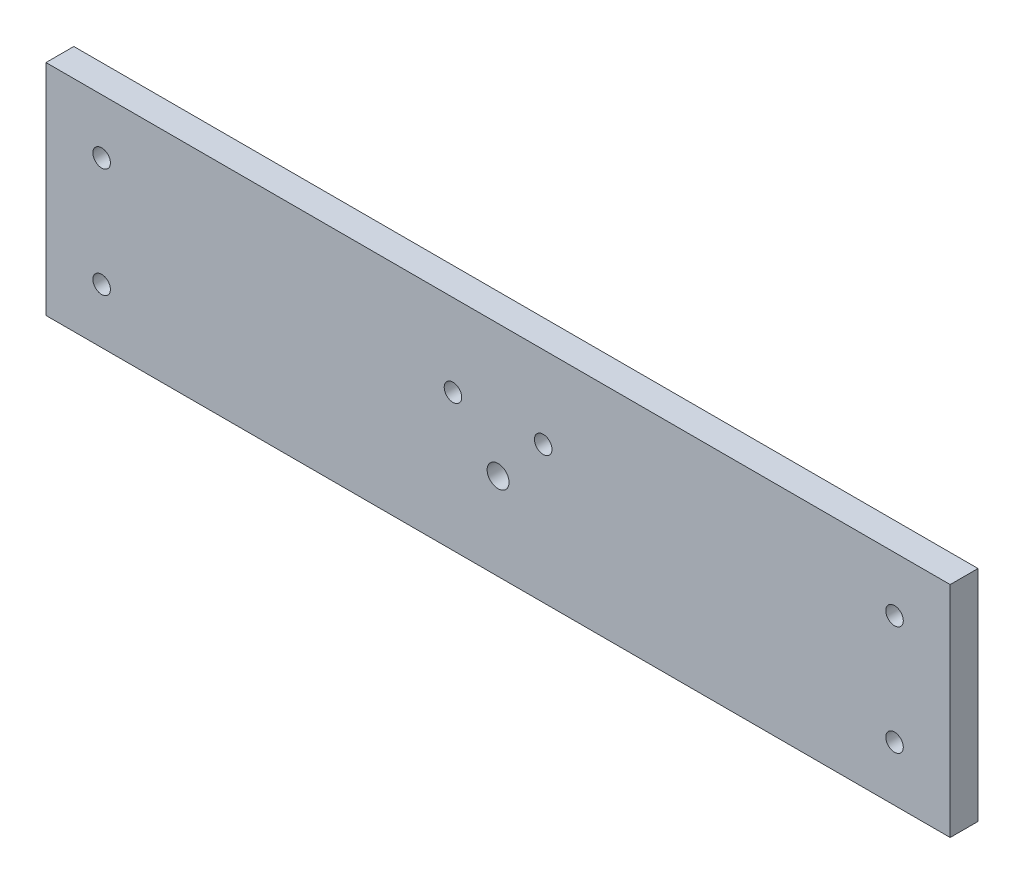
ISO-10303-21;
HEADER;
FILE_DESCRIPTION(('STEP AP214'),'2;1');
FILE_NAME('part.step','',(''),(''),'','','');
FILE_SCHEMA(('AUTOMOTIVE_DESIGN { 1 0 10303 214 1 1 1 1 }'));
ENDSEC;
DATA;
#1=APPLICATION_CONTEXT('core data for automotive mechanical design processes');
#2=APPLICATION_PROTOCOL_DEFINITION('international standard','automotive_design',2000,#1);
#3=PRODUCT_CONTEXT('',#1,'mechanical');
#4=PRODUCT('Part','Part','',(#3));
#5=PRODUCT_RELATED_PRODUCT_CATEGORY('part','',(#4));
#6=PRODUCT_DEFINITION_FORMATION('','',#4);
#7=PRODUCT_DEFINITION_CONTEXT('part definition',#1,'design');
#8=PRODUCT_DEFINITION('design','',#6,#7);
#9=PRODUCT_DEFINITION_SHAPE('','',#8);
#10=(LENGTH_UNIT() NAMED_UNIT(*) SI_UNIT(.MILLI.,.METRE.));
#11=(NAMED_UNIT(*) PLANE_ANGLE_UNIT() SI_UNIT($,.RADIAN.));
#12=(NAMED_UNIT(*) SI_UNIT($,.STERADIAN.) SOLID_ANGLE_UNIT());
#13=UNCERTAINTY_MEASURE_WITH_UNIT(LENGTH_MEASURE(1.E-05),#10,'distance_accuracy_value','');
#14=(GEOMETRIC_REPRESENTATION_CONTEXT(3) GLOBAL_UNCERTAINTY_ASSIGNED_CONTEXT((#13)) GLOBAL_UNIT_ASSIGNED_CONTEXT((#10,
#11,#12)) REPRESENTATION_CONTEXT('',''));
#15=CARTESIAN_POINT('',(0.,0.,0.));
#16=DIRECTION('',(0.,0.,1.));
#17=DIRECTION('',(1.,0.,0.));
#18=AXIS2_PLACEMENT_3D('',#15,#16,#17);
#19=CARTESIAN_POINT('',(-206.35,0.,12.7));
#20=DIRECTION('',(-1.,0.,0.));
#21=DIRECTION('',(0.,0.,1.));
#22=AXIS2_PLACEMENT_3D('',#19,#20,#21);
#23=PLANE('',#22);
#24=DIRECTION('',(0.,1.,0.));
#25=VECTOR('',#24,1.);
#26=CARTESIAN_POINT('',(-206.35,0.,0.));
#27=LINE('',#26,#25);
#28=CARTESIAN_POINT('',(-206.35,-50.,0.));
#29=VERTEX_POINT('',#28);
#30=CARTESIAN_POINT('',(-206.35,50.,0.));
#31=VERTEX_POINT('',#30);
#32=EDGE_CURVE('E114',#29,#31,#27,.T.);
#33=ORIENTED_EDGE('',*,*,#32,.F.);
#34=DIRECTION('',(0.,0.,-1.));
#35=VECTOR('',#34,1.);
#36=CARTESIAN_POINT('',(-206.35,-50.,12.7));
#37=LINE('',#36,#35);
#38=CARTESIAN_POINT('',(-206.35,-50.,12.7));
#39=VERTEX_POINT('',#38);
#40=EDGE_CURVE('E11',#39,#29,#37,.T.);
#41=ORIENTED_EDGE('',*,*,#40,.F.);
#42=DIRECTION('',(0.,1.,0.));
#43=VECTOR('',#42,1.);
#44=CARTESIAN_POINT('',(-206.35,0.,12.7));
#45=LINE('',#44,#43);
#46=CARTESIAN_POINT('',(-206.35,50.,12.7));
#47=VERTEX_POINT('',#46);
#48=EDGE_CURVE('E97',#39,#47,#45,.T.);
#49=ORIENTED_EDGE('',*,*,#48,.T.);
#50=DIRECTION('',(0.,0.,-1.));
#51=VECTOR('',#50,1.);
#52=CARTESIAN_POINT('',(-206.35,50.,12.7));
#53=LINE('',#52,#51);
#54=EDGE_CURVE('E76',#47,#31,#53,.T.);
#55=ORIENTED_EDGE('',*,*,#54,.T.);
#56=EDGE_LOOP('',(#33,#41,#49,#55));
#57=FACE_BOUND('',#56,.T.);
#58=ADVANCED_FACE('F36',(#57),#23,.T.);
#59=CARTESIAN_POINT('',(0.,-50.,12.7));
#60=DIRECTION('',(0.,-1.,0.));
#61=DIRECTION('',(1.,0.,0.));
#62=AXIS2_PLACEMENT_3D('',#59,#60,#61);
#63=PLANE('',#62);
#64=DIRECTION('',(-1.,0.,0.));
#65=VECTOR('',#64,1.);
#66=CARTESIAN_POINT('',(0.,-50.,0.));
#67=LINE('',#66,#65);
#68=CARTESIAN_POINT('',(206.35,-50.,0.));
#69=VERTEX_POINT('',#68);
#70=EDGE_CURVE('E88',#69,#29,#67,.T.);
#71=ORIENTED_EDGE('',*,*,#70,.F.);
#72=DIRECTION('',(0.,0.,-1.));
#73=VECTOR('',#72,1.);
#74=CARTESIAN_POINT('',(206.35,-50.,12.7));
#75=LINE('',#74,#73);
#76=CARTESIAN_POINT('',(206.35,-50.,12.7));
#77=VERTEX_POINT('',#76);
#78=EDGE_CURVE('E45',#77,#69,#75,.T.);
#79=ORIENTED_EDGE('',*,*,#78,.F.);
#80=DIRECTION('',(-1.,0.,0.));
#81=VECTOR('',#80,1.);
#82=CARTESIAN_POINT('',(0.,-50.,12.7));
#83=LINE('',#82,#81);
#84=EDGE_CURVE('E86',#77,#39,#83,.T.);
#85=ORIENTED_EDGE('',*,*,#84,.T.);
#86=ORIENTED_EDGE('',*,*,#40,.T.);
#87=EDGE_LOOP('',(#71,#79,#85,#86));
#88=FACE_BOUND('',#87,.T.);
#89=ADVANCED_FACE('F84',(#88),#63,.T.);
#90=CARTESIAN_POINT('',(206.35,0.,12.7));
#91=DIRECTION('',(-1.,0.,0.));
#92=DIRECTION('',(0.,0.,1.));
#93=AXIS2_PLACEMENT_3D('',#90,#91,#92);
#94=PLANE('',#93);
#95=DIRECTION('',(0.,1.,0.));
#96=VECTOR('',#95,1.);
#97=CARTESIAN_POINT('',(206.35,0.,0.));
#98=LINE('',#97,#96);
#99=CARTESIAN_POINT('',(206.35,50.,0.));
#100=VERTEX_POINT('',#99);
#101=EDGE_CURVE('E117',#69,#100,#98,.T.);
#102=ORIENTED_EDGE('',*,*,#101,.T.);
#103=DIRECTION('',(0.,0.,-1.));
#104=VECTOR('',#103,1.);
#105=CARTESIAN_POINT('',(206.35,50.,12.7));
#106=LINE('',#105,#104);
#107=CARTESIAN_POINT('',(206.35,50.,12.7));
#108=VERTEX_POINT('',#107);
#109=EDGE_CURVE('E91',#108,#100,#106,.T.);
#110=ORIENTED_EDGE('',*,*,#109,.F.);
#111=DIRECTION('',(0.,1.,0.));
#112=VECTOR('',#111,1.);
#113=CARTESIAN_POINT('',(206.35,0.,12.7));
#114=LINE('',#113,#112);
#115=EDGE_CURVE('E93',#77,#108,#114,.T.);
#116=ORIENTED_EDGE('',*,*,#115,.F.);
#117=ORIENTED_EDGE('',*,*,#78,.T.);
#118=EDGE_LOOP('',(#102,#110,#116,#117));
#119=FACE_BOUND('',#118,.T.);
#120=ADVANCED_FACE('F94',(#119),#94,.F.);
#121=CARTESIAN_POINT('',(-20.5900655847,12.5336144247,12.7));
#122=DIRECTION('',(0.,0.,-1.));
#123=DIRECTION('',(-1.,0.,0.));
#124=AXIS2_PLACEMENT_3D('',#121,#122,#123);
#125=CYLINDRICAL_SURFACE('',#124,3.99999999999999);
#126=CARTESIAN_POINT('',(-20.5900655847,12.5336144247,12.7));
#127=DIRECTION('',(0.,0.,1.));
#128=DIRECTION('',(1.,0.,0.));
#129=AXIS2_PLACEMENT_3D('',#126,#127,#128);
#130=CIRCLE('',#129,3.99999999999999);
#131=CARTESIAN_POINT('',(-16.5900655847,12.5336144247,12.7));
#132=VERTEX_POINT('',#131);
#133=EDGE_CURVE('E99',#132,#132,#130,.T.);
#134=ORIENTED_EDGE('',*,*,#133,.T.);
#135=EDGE_LOOP('',(#134));
#136=FACE_BOUND('',#135,.T.);
#137=CARTESIAN_POINT('',(-20.5900655847,12.5336144247,0.));
#138=DIRECTION('',(0.,0.,1.));
#139=DIRECTION('',(1.,0.,0.));
#140=AXIS2_PLACEMENT_3D('',#137,#138,#139);
#141=CIRCLE('',#140,3.99999999999999);
#142=CARTESIAN_POINT('',(-16.5900655847,12.5336144247,0.));
#143=VERTEX_POINT('',#142);
#144=EDGE_CURVE('E111',#143,#143,#141,.T.);
#145=ORIENTED_EDGE('',*,*,#144,.F.);
#146=EDGE_LOOP('',(#145));
#147=FACE_BOUND('',#146,.T.);
#148=ADVANCED_FACE('F133',(#136,#147),#125,.F.);
#149=CARTESIAN_POINT('',(20.5900655847,12.5336144247,12.7));
#150=DIRECTION('',(0.,0.,-1.));
#151=DIRECTION('',(-1.,0.,0.));
#152=AXIS2_PLACEMENT_3D('',#149,#150,#151);
#153=CYLINDRICAL_SURFACE('',#152,3.99999999999999);
#154=CARTESIAN_POINT('',(20.5900655847,12.5336144247,12.7));
#155=DIRECTION('',(0.,0.,1.));
#156=DIRECTION('',(1.,0.,0.));
#157=AXIS2_PLACEMENT_3D('',#154,#155,#156);
#158=CIRCLE('',#157,3.99999999999999);
#159=CARTESIAN_POINT('',(24.5900655847,12.5336144247,12.7));
#160=VERTEX_POINT('',#159);
#161=EDGE_CURVE('E146',#160,#160,#158,.T.);
#162=ORIENTED_EDGE('',*,*,#161,.T.);
#163=EDGE_LOOP('',(#162));
#164=FACE_BOUND('',#163,.T.);
#165=CARTESIAN_POINT('',(20.5900655847,12.5336144247,0.));
#166=DIRECTION('',(0.,0.,1.));
#167=DIRECTION('',(1.,0.,0.));
#168=AXIS2_PLACEMENT_3D('',#165,#166,#167);
#169=CIRCLE('',#168,3.99999999999999);
#170=CARTESIAN_POINT('',(24.5900655847,12.5336144247,0.));
#171=VERTEX_POINT('',#170);
#172=EDGE_CURVE('E107',#171,#171,#169,.T.);
#173=ORIENTED_EDGE('',*,*,#172,.F.);
#174=EDGE_LOOP('',(#173));
#175=FACE_BOUND('',#174,.T.);
#176=ADVANCED_FACE('F135',(#164,#175),#153,.F.);
#177=CARTESIAN_POINT('',(1.9999453482189E-10,-10.3015151902,12.7));
#178=DIRECTION('',(0.,0.,-1.));
#179=DIRECTION('',(-1.,0.,0.));
#180=AXIS2_PLACEMENT_3D('',#177,#178,#179);
#181=CYLINDRICAL_SURFACE('',#180,5.);
#182=CARTESIAN_POINT('',(1.9999453482189E-10,-10.3015151902,12.7));
#183=DIRECTION('',(0.,0.,1.));
#184=DIRECTION('',(1.,0.,0.));
#185=AXIS2_PLACEMENT_3D('',#182,#183,#184);
#186=CIRCLE('',#185,5.);
#187=CARTESIAN_POINT('',(5.0000000002,-10.3015151902,12.7));
#188=VERTEX_POINT('',#187);
#189=EDGE_CURVE('E120',#188,#188,#186,.T.);
#190=ORIENTED_EDGE('',*,*,#189,.T.);
#191=EDGE_LOOP('',(#190));
#192=FACE_BOUND('',#191,.T.);
#193=CARTESIAN_POINT('',(1.9999453482189E-10,-10.3015151902,0.));
#194=DIRECTION('',(0.,0.,1.));
#195=DIRECTION('',(1.,0.,0.));
#196=AXIS2_PLACEMENT_3D('',#193,#194,#195);
#197=CIRCLE('',#196,5.);
#198=CARTESIAN_POINT('',(5.0000000002,-10.3015151902,0.));
#199=VERTEX_POINT('',#198);
#200=EDGE_CURVE('E104',#199,#199,#197,.T.);
#201=ORIENTED_EDGE('',*,*,#200,.F.);
#202=EDGE_LOOP('',(#201));
#203=FACE_BOUND('',#202,.T.);
#204=ADVANCED_FACE('F38',(#192,#203),#181,.F.);
#205=CARTESIAN_POINT('',(0.,50.,12.7));
#206=DIRECTION('',(0.,-1.,0.));
#207=DIRECTION('',(1.,0.,0.));
#208=AXIS2_PLACEMENT_3D('',#205,#206,#207);
#209=PLANE('',#208);
#210=DIRECTION('',(-1.,0.,0.));
#211=VECTOR('',#210,1.);
#212=CARTESIAN_POINT('',(0.,50.,0.));
#213=LINE('',#212,#211);
#214=EDGE_CURVE('E69',#100,#31,#213,.T.);
#215=ORIENTED_EDGE('',*,*,#214,.T.);
#216=ORIENTED_EDGE('',*,*,#54,.F.);
#217=DIRECTION('',(-1.,0.,0.));
#218=VECTOR('',#217,1.);
#219=CARTESIAN_POINT('',(0.,50.,12.7));
#220=LINE('',#219,#218);
#221=EDGE_CURVE('E53',#108,#47,#220,.T.);
#222=ORIENTED_EDGE('',*,*,#221,.F.);
#223=ORIENTED_EDGE('',*,*,#109,.T.);
#224=EDGE_LOOP('',(#215,#216,#222,#223));
#225=FACE_BOUND('',#224,.T.);
#226=ADVANCED_FACE('F123',(#225),#209,.F.);
#227=CARTESIAN_POINT('',(0.,0.,12.7));
#228=DIRECTION('',(0.,0.,1.));
#229=DIRECTION('',(1.,0.,0.));
#230=AXIS2_PLACEMENT_3D('',#227,#228,#229);
#231=PLANE('',#230);
#232=CARTESIAN_POINT('',(180.95,25.,12.7));
#233=DIRECTION('',(0.,0.,1.));
#234=DIRECTION('',(-1.,0.,0.));
#235=AXIS2_PLACEMENT_3D('',#232,#233,#234);
#236=CIRCLE('',#235,3.99999999999999);
#237=CARTESIAN_POINT('',(176.95,25.,12.7));
#238=VERTEX_POINT('',#237);
#239=EDGE_CURVE('E247',#238,#238,#236,.T.);
#240=ORIENTED_EDGE('',*,*,#239,.F.);
#241=EDGE_LOOP('',(#240));
#242=FACE_BOUND('',#241,.T.);
#243=CARTESIAN_POINT('',(180.95,-25.,12.7));
#244=DIRECTION('',(0.,0.,1.));
#245=DIRECTION('',(1.,0.,0.));
#246=AXIS2_PLACEMENT_3D('',#243,#244,#245);
#247=CIRCLE('',#246,3.99999999999999);
#248=CARTESIAN_POINT('',(184.95,-25.,12.7));
#249=VERTEX_POINT('',#248);
#250=EDGE_CURVE('E250',#249,#249,#247,.T.);
#251=ORIENTED_EDGE('',*,*,#250,.F.);
#252=EDGE_LOOP('',(#251));
#253=FACE_BOUND('',#252,.T.);
#254=CARTESIAN_POINT('',(-180.95,-25.,12.7));
#255=DIRECTION('',(0.,0.,1.));
#256=DIRECTION('',(-1.,0.,0.));
#257=AXIS2_PLACEMENT_3D('',#254,#255,#256);
#258=CIRCLE('',#257,3.99999999999999);
#259=CARTESIAN_POINT('',(-184.95,-25.,12.7));
#260=VERTEX_POINT('',#259);
#261=EDGE_CURVE('E259',#260,#260,#258,.T.);
#262=ORIENTED_EDGE('',*,*,#261,.F.);
#263=EDGE_LOOP('',(#262));
#264=FACE_BOUND('',#263,.T.);
#265=CARTESIAN_POINT('',(-180.95,25.,12.7));
#266=DIRECTION('',(0.,0.,1.));
#267=DIRECTION('',(1.,0.,0.));
#268=AXIS2_PLACEMENT_3D('',#265,#266,#267);
#269=CIRCLE('',#268,3.99999999999999);
#270=CARTESIAN_POINT('',(-176.95,25.,12.7));
#271=VERTEX_POINT('',#270);
#272=EDGE_CURVE('E265',#271,#271,#269,.T.);
#273=ORIENTED_EDGE('',*,*,#272,.F.);
#274=EDGE_LOOP('',(#273));
#275=FACE_BOUND('',#274,.T.);
#276=ORIENTED_EDGE('',*,*,#189,.F.);
#277=EDGE_LOOP('',(#276));
#278=FACE_BOUND('',#277,.T.);
#279=ORIENTED_EDGE('',*,*,#161,.F.);
#280=EDGE_LOOP('',(#279));
#281=FACE_BOUND('',#280,.T.);
#282=ORIENTED_EDGE('',*,*,#133,.F.);
#283=EDGE_LOOP('',(#282));
#284=FACE_BOUND('',#283,.T.);
#285=ORIENTED_EDGE('',*,*,#48,.F.);
#286=ORIENTED_EDGE('',*,*,#84,.F.);
#287=ORIENTED_EDGE('',*,*,#115,.T.);
#288=ORIENTED_EDGE('',*,*,#221,.T.);
#289=EDGE_LOOP('',(#285,#286,#287,#288));
#290=FACE_BOUND('',#289,.T.);
#291=ADVANCED_FACE('F96',(#242,#253,#264,#275,#278,#281,#284,#290),#231,.T.);
#292=CARTESIAN_POINT('',(0.,0.,0.));
#293=DIRECTION('',(0.,0.,1.));
#294=DIRECTION('',(1.,0.,0.));
#295=AXIS2_PLACEMENT_3D('',#292,#293,#294);
#296=PLANE('',#295);
#297=CARTESIAN_POINT('',(180.95,25.,0.));
#298=DIRECTION('',(0.,0.,1.));
#299=DIRECTION('',(1.,0.,0.));
#300=AXIS2_PLACEMENT_3D('',#297,#298,#299);
#301=CIRCLE('',#300,3.99999999999999);
#302=CARTESIAN_POINT('',(184.95,25.,0.));
#303=VERTEX_POINT('',#302);
#304=EDGE_CURVE('E249',#303,#303,#301,.F.);
#305=ORIENTED_EDGE('',*,*,#304,.F.);
#306=EDGE_LOOP('',(#305));
#307=FACE_BOUND('',#306,.T.);
#308=CARTESIAN_POINT('',(180.95,-25.,0.));
#309=DIRECTION('',(0.,0.,1.));
#310=DIRECTION('',(1.,0.,0.));
#311=AXIS2_PLACEMENT_3D('',#308,#309,#310);
#312=CIRCLE('',#311,3.99999999999999);
#313=CARTESIAN_POINT('',(184.95,-25.,0.));
#314=VERTEX_POINT('',#313);
#315=EDGE_CURVE('E253',#314,#314,#312,.F.);
#316=ORIENTED_EDGE('',*,*,#315,.F.);
#317=EDGE_LOOP('',(#316));
#318=FACE_BOUND('',#317,.T.);
#319=CARTESIAN_POINT('',(-180.95,-25.,0.));
#320=DIRECTION('',(0.,0.,1.));
#321=DIRECTION('',(1.,0.,0.));
#322=AXIS2_PLACEMENT_3D('',#319,#320,#321);
#323=CIRCLE('',#322,3.99999999999999);
#324=CARTESIAN_POINT('',(-176.95,-25.,0.));
#325=VERTEX_POINT('',#324);
#326=EDGE_CURVE('E262',#325,#325,#323,.F.);
#327=ORIENTED_EDGE('',*,*,#326,.F.);
#328=EDGE_LOOP('',(#327));
#329=FACE_BOUND('',#328,.T.);
#330=CARTESIAN_POINT('',(-180.95,25.,0.));
#331=DIRECTION('',(0.,0.,1.));
#332=DIRECTION('',(1.,0.,0.));
#333=AXIS2_PLACEMENT_3D('',#330,#331,#332);
#334=CIRCLE('',#333,3.99999999999999);
#335=CARTESIAN_POINT('',(-176.95,25.,0.));
#336=VERTEX_POINT('',#335);
#337=EDGE_CURVE('E108',#336,#336,#334,.F.);
#338=ORIENTED_EDGE('',*,*,#337,.F.);
#339=EDGE_LOOP('',(#338));
#340=FACE_BOUND('',#339,.T.);
#341=ORIENTED_EDGE('',*,*,#200,.T.);
#342=EDGE_LOOP('',(#341));
#343=FACE_BOUND('',#342,.T.);
#344=ORIENTED_EDGE('',*,*,#172,.T.);
#345=EDGE_LOOP('',(#344));
#346=FACE_BOUND('',#345,.T.);
#347=ORIENTED_EDGE('',*,*,#144,.T.);
#348=EDGE_LOOP('',(#347));
#349=FACE_BOUND('',#348,.T.);
#350=ORIENTED_EDGE('',*,*,#32,.T.);
#351=ORIENTED_EDGE('',*,*,#214,.F.);
#352=ORIENTED_EDGE('',*,*,#101,.F.);
#353=ORIENTED_EDGE('',*,*,#70,.T.);
#354=EDGE_LOOP('',(#350,#351,#352,#353));
#355=FACE_BOUND('',#354,.T.);
#356=ADVANCED_FACE('F124',(#307,#318,#329,#340,#343,#346,#349,#355),#296,.F.);
#357=CARTESIAN_POINT('',(-180.95,25.,-0.000999999999999265));
#358=DIRECTION('',(0.,0.,1.));
#359=DIRECTION('',(1.,0.,0.));
#360=AXIS2_PLACEMENT_3D('',#357,#358,#359);
#361=CYLINDRICAL_SURFACE('',#360,3.99999999999999);
#362=ORIENTED_EDGE('',*,*,#272,.T.);
#363=EDGE_LOOP('',(#362));
#364=FACE_BOUND('',#363,.T.);
#365=ORIENTED_EDGE('',*,*,#337,.T.);
#366=EDGE_LOOP('',(#365));
#367=FACE_BOUND('',#366,.T.);
#368=ADVANCED_FACE('F151',(#364,#367),#361,.F.);
#369=CARTESIAN_POINT('',(-180.95,-25.,-0.000999999999999265));
#370=DIRECTION('',(0.,0.,1.));
#371=DIRECTION('',(1.,0.,0.));
#372=AXIS2_PLACEMENT_3D('',#369,#370,#371);
#373=CYLINDRICAL_SURFACE('',#372,3.99999999999999);
#374=ORIENTED_EDGE('',*,*,#261,.T.);
#375=EDGE_LOOP('',(#374));
#376=FACE_BOUND('',#375,.T.);
#377=ORIENTED_EDGE('',*,*,#326,.T.);
#378=EDGE_LOOP('',(#377));
#379=FACE_BOUND('',#378,.T.);
#380=ADVANCED_FACE('F160',(#376,#379),#373,.F.);
#381=CARTESIAN_POINT('',(180.95,-25.,-0.000999999999999265));
#382=DIRECTION('',(0.,0.,1.));
#383=DIRECTION('',(1.,0.,0.));
#384=AXIS2_PLACEMENT_3D('',#381,#382,#383);
#385=CYLINDRICAL_SURFACE('',#384,3.99999999999999);
#386=ORIENTED_EDGE('',*,*,#250,.T.);
#387=EDGE_LOOP('',(#386));
#388=FACE_BOUND('',#387,.T.);
#389=ORIENTED_EDGE('',*,*,#315,.T.);
#390=EDGE_LOOP('',(#389));
#391=FACE_BOUND('',#390,.T.);
#392=ADVANCED_FACE('F220',(#388,#391),#385,.F.);
#393=CARTESIAN_POINT('',(180.95,25.,-0.000999999999999265));
#394=DIRECTION('',(0.,0.,1.));
#395=DIRECTION('',(1.,0.,0.));
#396=AXIS2_PLACEMENT_3D('',#393,#394,#395);
#397=CYLINDRICAL_SURFACE('',#396,3.99999999999999);
#398=ORIENTED_EDGE('',*,*,#239,.T.);
#399=EDGE_LOOP('',(#398));
#400=FACE_BOUND('',#399,.T.);
#401=ORIENTED_EDGE('',*,*,#304,.T.);
#402=EDGE_LOOP('',(#401));
#403=FACE_BOUND('',#402,.T.);
#404=ADVANCED_FACE('F230',(#400,#403),#397,.F.);
#405=CLOSED_SHELL('',(#58,#89,#120,#148,#176,#204,#226,#291,#356,#368,#380,#392,#404));
#406=MANIFOLD_SOLID_BREP('B2',#405);
#407=ADVANCED_BREP_SHAPE_REPRESENTATION('',(#18,#406),#14);
#408=SHAPE_DEFINITION_REPRESENTATION(#9,#407);
ENDSEC;
END-ISO-10303-21;
